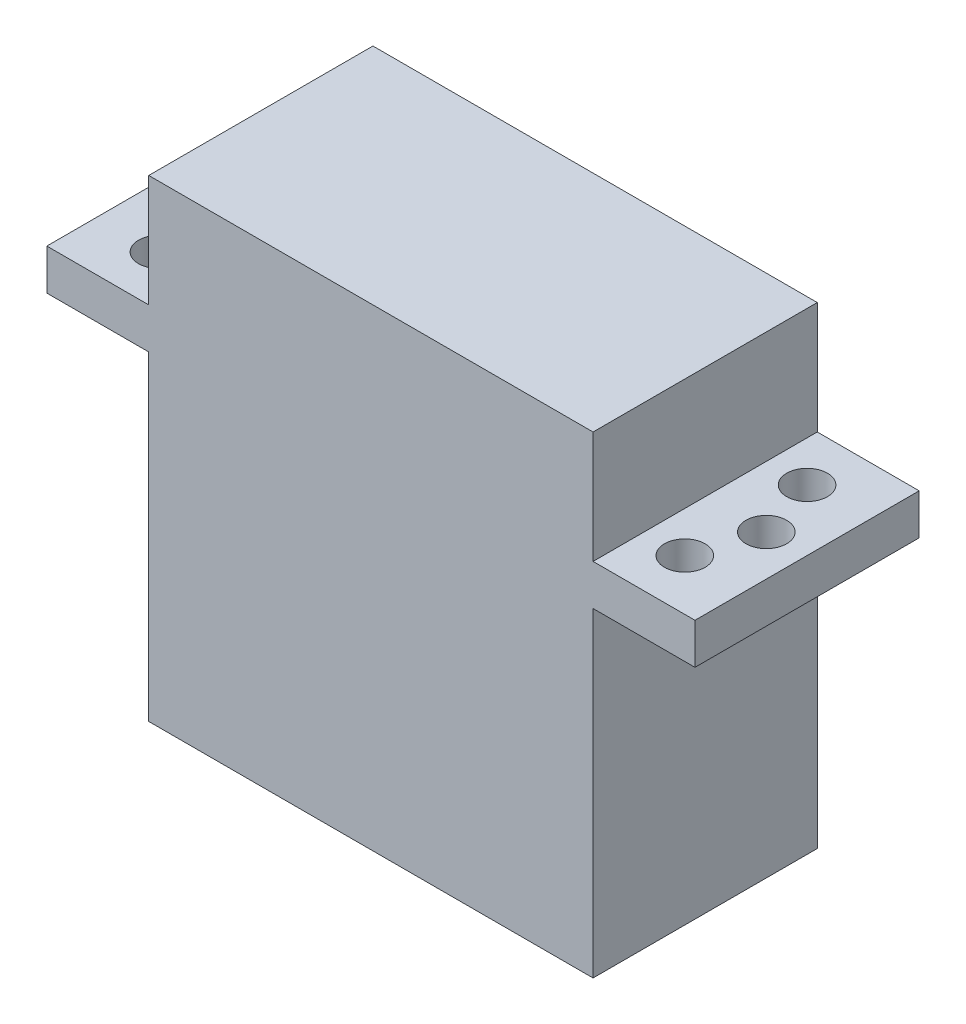
ISO-10303-21;
HEADER;
FILE_DESCRIPTION(('STEP AP214'),'2;1');
FILE_NAME('part.step','',(''),(''),'','','');
FILE_SCHEMA(('AUTOMOTIVE_DESIGN { 1 0 10303 214 1 1 1 1 }'));
ENDSEC;
DATA;
#1=APPLICATION_CONTEXT('core data for automotive mechanical design processes');
#2=APPLICATION_PROTOCOL_DEFINITION('international standard','automotive_design',2000,#1);
#3=PRODUCT_CONTEXT('',#1,'mechanical');
#4=PRODUCT('Part','Part','',(#3));
#5=PRODUCT_RELATED_PRODUCT_CATEGORY('part','',(#4));
#6=PRODUCT_DEFINITION_FORMATION('','',#4);
#7=PRODUCT_DEFINITION_CONTEXT('part definition',#1,'design');
#8=PRODUCT_DEFINITION('design','',#6,#7);
#9=PRODUCT_DEFINITION_SHAPE('','',#8);
#10=(LENGTH_UNIT() NAMED_UNIT(*) SI_UNIT(.MILLI.,.METRE.));
#11=(NAMED_UNIT(*) PLANE_ANGLE_UNIT() SI_UNIT($,.RADIAN.));
#12=(NAMED_UNIT(*) SI_UNIT($,.STERADIAN.) SOLID_ANGLE_UNIT());
#13=UNCERTAINTY_MEASURE_WITH_UNIT(LENGTH_MEASURE(1.E-05),#10,'distance_accuracy_value','');
#14=(GEOMETRIC_REPRESENTATION_CONTEXT(3) GLOBAL_UNCERTAINTY_ASSIGNED_CONTEXT((#13)) GLOBAL_UNIT_ASSIGNED_CONTEXT((#10,
#11,#12)) REPRESENTATION_CONTEXT('',''));
#15=CARTESIAN_POINT('',(0.,0.,0.));
#16=DIRECTION('',(0.,0.,1.));
#17=DIRECTION('',(1.,0.,0.));
#18=AXIS2_PLACEMENT_3D('',#15,#16,#17);
#19=CARTESIAN_POINT('',(-10.9,-11.6,5.5));
#20=DIRECTION('',(1.,0.,0.));
#21=DIRECTION('',(0.,0.,-1.));
#22=AXIS2_PLACEMENT_3D('',#19,#20,#21);
#23=PLANE('',#22);
#24=DIRECTION('',(0.,0.,1.));
#25=VECTOR('',#24,1.);
#26=CARTESIAN_POINT('',(-10.9,4.1,5.5));
#27=LINE('',#26,#25);
#28=CARTESIAN_POINT('',(-10.9,4.1,-5.5));
#29=VERTEX_POINT('',#28);
#30=CARTESIAN_POINT('',(-10.9,4.1,5.5));
#31=VERTEX_POINT('',#30);
#32=EDGE_CURVE('E141',#29,#31,#27,.T.);
#33=ORIENTED_EDGE('',*,*,#32,.F.);
#34=DIRECTION('',(0.,-1.,0.));
#35=VECTOR('',#34,1.);
#36=CARTESIAN_POINT('',(-10.9,-11.6,-5.5));
#37=LINE('',#36,#35);
#38=CARTESIAN_POINT('',(-10.9,-11.6,-5.5));
#39=VERTEX_POINT('',#38);
#40=EDGE_CURVE('E179',#29,#39,#37,.T.);
#41=ORIENTED_EDGE('',*,*,#40,.T.);
#42=DIRECTION('',(0.,0.,-1.));
#43=VECTOR('',#42,1.);
#44=CARTESIAN_POINT('',(-10.9,-11.6,5.5));
#45=LINE('',#44,#43);
#46=CARTESIAN_POINT('',(-10.9,-11.6,5.5));
#47=VERTEX_POINT('',#46);
#48=EDGE_CURVE('E11',#47,#39,#45,.T.);
#49=ORIENTED_EDGE('',*,*,#48,.F.);
#50=DIRECTION('',(0.,-1.,0.));
#51=VECTOR('',#50,1.);
#52=CARTESIAN_POINT('',(-10.9,-11.6,5.5));
#53=LINE('',#52,#51);
#54=EDGE_CURVE('E183',#31,#47,#53,.T.);
#55=ORIENTED_EDGE('',*,*,#54,.F.);
#56=EDGE_LOOP('',(#33,#41,#49,#55));
#57=FACE_BOUND('',#56,.T.);
#58=ADVANCED_FACE('F32',(#57),#23,.F.);
#59=CARTESIAN_POINT('',(10.9,-11.6,5.5));
#60=DIRECTION('',(-1.,0.,0.));
#61=DIRECTION('',(0.,0.,1.));
#62=AXIS2_PLACEMENT_3D('',#59,#60,#61);
#63=PLANE('',#62);
#64=DIRECTION('',(0.,0.,-1.));
#65=VECTOR('',#64,1.);
#66=CARTESIAN_POINT('',(10.9,4.1,5.5));
#67=LINE('',#66,#65);
#68=CARTESIAN_POINT('',(10.9,4.1,5.5));
#69=VERTEX_POINT('',#68);
#70=CARTESIAN_POINT('',(10.9,4.1,-5.5));
#71=VERTEX_POINT('',#70);
#72=EDGE_CURVE('E176',#69,#71,#67,.T.);
#73=ORIENTED_EDGE('',*,*,#72,.F.);
#74=DIRECTION('',(0.,1.,0.));
#75=VECTOR('',#74,1.);
#76=CARTESIAN_POINT('',(10.9,-11.6,5.5));
#77=LINE('',#76,#75);
#78=CARTESIAN_POINT('',(10.9,-11.6,5.5));
#79=VERTEX_POINT('',#78);
#80=EDGE_CURVE('E186',#79,#69,#77,.T.);
#81=ORIENTED_EDGE('',*,*,#80,.F.);
#82=DIRECTION('',(0.,0.,-1.));
#83=VECTOR('',#82,1.);
#84=CARTESIAN_POINT('',(10.9,-11.6,5.5));
#85=LINE('',#84,#83);
#86=CARTESIAN_POINT('',(10.9,-11.6,-5.5));
#87=VERTEX_POINT('',#86);
#88=EDGE_CURVE('E41',#79,#87,#85,.T.);
#89=ORIENTED_EDGE('',*,*,#88,.T.);
#90=DIRECTION('',(0.,1.,0.));
#91=VECTOR('',#90,1.);
#92=CARTESIAN_POINT('',(10.9,-11.6,-5.5));
#93=LINE('',#92,#91);
#94=EDGE_CURVE('E198',#87,#71,#93,.T.);
#95=ORIENTED_EDGE('',*,*,#94,.T.);
#96=EDGE_LOOP('',(#73,#81,#89,#95));
#97=FACE_BOUND('',#96,.T.);
#98=ADVANCED_FACE('F235',(#97),#63,.F.);
#99=CARTESIAN_POINT('',(-10.9,11.6,-5.5));
#100=VERTEX_POINT('',#99);
#101=CARTESIAN_POINT('',(-10.9,6.1,-5.5));
#102=VERTEX_POINT('',#101);
#103=EDGE_CURVE('E192',#100,#102,#37,.T.);
#104=ORIENTED_EDGE('',*,*,#103,.T.);
#105=DIRECTION('',(0.,0.,1.));
#106=VECTOR('',#105,1.);
#107=CARTESIAN_POINT('',(-10.9,6.1,5.5));
#108=LINE('',#107,#106);
#109=CARTESIAN_POINT('',(-10.9,6.1,5.5));
#110=VERTEX_POINT('',#109);
#111=EDGE_CURVE('E174',#102,#110,#108,.T.);
#112=ORIENTED_EDGE('',*,*,#111,.T.);
#113=CARTESIAN_POINT('',(-10.9,11.6,5.5));
#114=VERTEX_POINT('',#113);
#115=EDGE_CURVE('E180',#114,#110,#53,.T.);
#116=ORIENTED_EDGE('',*,*,#115,.F.);
#117=DIRECTION('',(0.,0.,-1.));
#118=VECTOR('',#117,1.);
#119=CARTESIAN_POINT('',(-10.9,11.6,5.5));
#120=LINE('',#119,#118);
#121=EDGE_CURVE('E191',#114,#100,#120,.T.);
#122=ORIENTED_EDGE('',*,*,#121,.T.);
#123=EDGE_LOOP('',(#104,#112,#116,#122));
#124=FACE_BOUND('',#123,.T.);
#125=ADVANCED_FACE('F34',(#124),#23,.F.);
#126=CARTESIAN_POINT('',(10.9,-11.6,5.5));
#127=DIRECTION('',(0.,1.,0.));
#128=DIRECTION('',(-1.,0.,0.));
#129=AXIS2_PLACEMENT_3D('',#126,#127,#128);
#130=PLANE('',#129);
#131=DIRECTION('',(1.,0.,0.));
#132=VECTOR('',#131,1.);
#133=CARTESIAN_POINT('',(10.9,-11.6,-5.5));
#134=LINE('',#133,#132);
#135=EDGE_CURVE('E195',#39,#87,#134,.T.);
#136=ORIENTED_EDGE('',*,*,#135,.T.);
#137=ORIENTED_EDGE('',*,*,#88,.F.);
#138=DIRECTION('',(1.,0.,0.));
#139=VECTOR('',#138,1.);
#140=CARTESIAN_POINT('',(10.9,-11.6,5.5));
#141=LINE('',#140,#139);
#142=EDGE_CURVE('E182',#47,#79,#141,.T.);
#143=ORIENTED_EDGE('',*,*,#142,.F.);
#144=ORIENTED_EDGE('',*,*,#48,.T.);
#145=EDGE_LOOP('',(#136,#137,#143,#144));
#146=FACE_BOUND('',#145,.T.);
#147=ADVANCED_FACE('F244',(#146),#130,.F.);
#148=CARTESIAN_POINT('',(10.9,6.1,5.5));
#149=VERTEX_POINT('',#148);
#150=CARTESIAN_POINT('',(10.9,11.6,5.5));
#151=VERTEX_POINT('',#150);
#152=EDGE_CURVE('E185',#149,#151,#77,.T.);
#153=ORIENTED_EDGE('',*,*,#152,.F.);
#154=DIRECTION('',(0.,0.,-1.));
#155=VECTOR('',#154,1.);
#156=CARTESIAN_POINT('',(10.9,6.1,5.5));
#157=LINE('',#156,#155);
#158=CARTESIAN_POINT('',(10.9,6.1,-5.5));
#159=VERTEX_POINT('',#158);
#160=EDGE_CURVE('E168',#149,#159,#157,.T.);
#161=ORIENTED_EDGE('',*,*,#160,.T.);
#162=CARTESIAN_POINT('',(10.9,11.6,-5.5));
#163=VERTEX_POINT('',#162);
#164=EDGE_CURVE('E197',#159,#163,#93,.T.);
#165=ORIENTED_EDGE('',*,*,#164,.T.);
#166=DIRECTION('',(0.,0.,-1.));
#167=VECTOR('',#166,1.);
#168=CARTESIAN_POINT('',(10.9,11.6,5.5));
#169=LINE('',#168,#167);
#170=EDGE_CURVE('E205',#151,#163,#169,.T.);
#171=ORIENTED_EDGE('',*,*,#170,.F.);
#172=EDGE_LOOP('',(#153,#161,#165,#171));
#173=FACE_BOUND('',#172,.T.);
#174=ADVANCED_FACE('F242',(#173),#63,.F.);
#175=CARTESIAN_POINT('',(10.9,11.6,5.5));
#176=DIRECTION('',(0.,-1.,0.));
#177=DIRECTION('',(1.,0.,0.));
#178=AXIS2_PLACEMENT_3D('',#175,#176,#177);
#179=PLANE('',#178);
#180=DIRECTION('',(-1.,0.,0.));
#181=VECTOR('',#180,1.);
#182=CARTESIAN_POINT('',(10.9,11.6,-5.5));
#183=LINE('',#182,#181);
#184=EDGE_CURVE('E201',#163,#100,#183,.T.);
#185=ORIENTED_EDGE('',*,*,#184,.T.);
#186=ORIENTED_EDGE('',*,*,#121,.F.);
#187=DIRECTION('',(-1.,0.,0.));
#188=VECTOR('',#187,1.);
#189=CARTESIAN_POINT('',(10.9,11.6,5.5));
#190=LINE('',#189,#188);
#191=EDGE_CURVE('E189',#151,#114,#190,.T.);
#192=ORIENTED_EDGE('',*,*,#191,.F.);
#193=ORIENTED_EDGE('',*,*,#170,.T.);
#194=EDGE_LOOP('',(#185,#186,#192,#193));
#195=FACE_BOUND('',#194,.T.);
#196=ADVANCED_FACE('F300',(#195),#179,.F.);
#197=CARTESIAN_POINT('',(0.,0.,5.5));
#198=DIRECTION('',(0.,0.,1.));
#199=DIRECTION('',(1.,0.,0.));
#200=AXIS2_PLACEMENT_3D('',#197,#198,#199);
#201=PLANE('',#200);
#202=ORIENTED_EDGE('',*,*,#115,.T.);
#203=DIRECTION('',(1.,0.,0.));
#204=VECTOR('',#203,1.);
#205=CARTESIAN_POINT('',(15.9,6.1,5.5));
#206=LINE('',#205,#204);
#207=CARTESIAN_POINT('',(-15.9,6.1,5.5));
#208=VERTEX_POINT('',#207);
#209=EDGE_CURVE('E49',#208,#110,#206,.T.);
#210=ORIENTED_EDGE('',*,*,#209,.F.);
#211=DIRECTION('',(0.,1.,0.));
#212=VECTOR('',#211,1.);
#213=CARTESIAN_POINT('',(-15.9,4.1,5.5));
#214=LINE('',#213,#212);
#215=CARTESIAN_POINT('',(-15.9,4.1,5.5));
#216=VERTEX_POINT('',#215);
#217=EDGE_CURVE('E124',#216,#208,#214,.T.);
#218=ORIENTED_EDGE('',*,*,#217,.F.);
#219=DIRECTION('',(1.,0.,0.));
#220=VECTOR('',#219,1.);
#221=CARTESIAN_POINT('',(15.9,4.1,5.5));
#222=LINE('',#221,#220);
#223=EDGE_CURVE('E128',#216,#31,#222,.T.);
#224=ORIENTED_EDGE('',*,*,#223,.T.);
#225=ORIENTED_EDGE('',*,*,#54,.T.);
#226=ORIENTED_EDGE('',*,*,#142,.T.);
#227=ORIENTED_EDGE('',*,*,#80,.T.);
#228=CARTESIAN_POINT('',(15.9,4.1,5.5));
#229=VERTEX_POINT('',#228);
#230=EDGE_CURVE('E143',#69,#229,#222,.T.);
#231=ORIENTED_EDGE('',*,*,#230,.T.);
#232=DIRECTION('',(0.,1.,0.));
#233=VECTOR('',#232,1.);
#234=CARTESIAN_POINT('',(15.9,4.1,5.5));
#235=LINE('',#234,#233);
#236=CARTESIAN_POINT('',(15.9,6.1,5.5));
#237=VERTEX_POINT('',#236);
#238=EDGE_CURVE('E133',#229,#237,#235,.T.);
#239=ORIENTED_EDGE('',*,*,#238,.T.);
#240=EDGE_CURVE('E163',#149,#237,#206,.T.);
#241=ORIENTED_EDGE('',*,*,#240,.F.);
#242=ORIENTED_EDGE('',*,*,#152,.T.);
#243=ORIENTED_EDGE('',*,*,#191,.T.);
#244=EDGE_LOOP('',(#202,#210,#218,#224,#225,#226,#227,#231,#239,#241,#242,#243));
#245=FACE_BOUND('',#244,.T.);
#246=ADVANCED_FACE('F127',(#245),#201,.T.);
#247=CARTESIAN_POINT('',(0.,0.,-5.5));
#248=DIRECTION('',(0.,0.,1.));
#249=DIRECTION('',(1.,0.,0.));
#250=AXIS2_PLACEMENT_3D('',#247,#248,#249);
#251=PLANE('',#250);
#252=ORIENTED_EDGE('',*,*,#164,.F.);
#253=DIRECTION('',(-1.,0.,0.));
#254=VECTOR('',#253,1.);
#255=CARTESIAN_POINT('',(15.9,6.1,-5.5));
#256=LINE('',#255,#254);
#257=CARTESIAN_POINT('',(15.9,6.1,-5.5));
#258=VERTEX_POINT('',#257);
#259=EDGE_CURVE('E57',#258,#159,#256,.T.);
#260=ORIENTED_EDGE('',*,*,#259,.F.);
#261=DIRECTION('',(0.,1.,0.));
#262=VECTOR('',#261,1.);
#263=CARTESIAN_POINT('',(15.9,4.1,-5.5));
#264=LINE('',#263,#262);
#265=CARTESIAN_POINT('',(15.9,4.1,-5.5));
#266=VERTEX_POINT('',#265);
#267=EDGE_CURVE('E169',#266,#258,#264,.T.);
#268=ORIENTED_EDGE('',*,*,#267,.F.);
#269=DIRECTION('',(-1.,0.,0.));
#270=VECTOR('',#269,1.);
#271=CARTESIAN_POINT('',(15.9,4.1,-5.5));
#272=LINE('',#271,#270);
#273=EDGE_CURVE('E134',#266,#71,#272,.T.);
#274=ORIENTED_EDGE('',*,*,#273,.T.);
#275=ORIENTED_EDGE('',*,*,#94,.F.);
#276=ORIENTED_EDGE('',*,*,#135,.F.);
#277=ORIENTED_EDGE('',*,*,#40,.F.);
#278=CARTESIAN_POINT('',(-15.9,4.1,-5.5));
#279=VERTEX_POINT('',#278);
#280=EDGE_CURVE('E158',#29,#279,#272,.T.);
#281=ORIENTED_EDGE('',*,*,#280,.T.);
#282=DIRECTION('',(0.,1.,0.));
#283=VECTOR('',#282,1.);
#284=CARTESIAN_POINT('',(-15.9,4.1,-5.5));
#285=LINE('',#284,#283);
#286=CARTESIAN_POINT('',(-15.9,6.1,-5.5));
#287=VERTEX_POINT('',#286);
#288=EDGE_CURVE('E148',#279,#287,#285,.T.);
#289=ORIENTED_EDGE('',*,*,#288,.T.);
#290=EDGE_CURVE('E150',#102,#287,#256,.T.);
#291=ORIENTED_EDGE('',*,*,#290,.F.);
#292=ORIENTED_EDGE('',*,*,#103,.F.);
#293=ORIENTED_EDGE('',*,*,#184,.F.);
#294=EDGE_LOOP('',(#252,#260,#268,#274,#275,#276,#277,#281,#289,#291,#292,#293));
#295=FACE_BOUND('',#294,.T.);
#296=ADVANCED_FACE('F257',(#295),#251,.F.);
#297=CARTESIAN_POINT('',(15.9,4.1,5.5));
#298=DIRECTION('',(1.,0.,0.));
#299=DIRECTION('',(0.,1.,0.));
#300=AXIS2_PLACEMENT_3D('',#297,#298,#299);
#301=PLANE('',#300);
#302=DIRECTION('',(0.,0.,-1.));
#303=VECTOR('',#302,1.);
#304=CARTESIAN_POINT('',(15.9,6.1,5.5));
#305=LINE('',#304,#303);
#306=EDGE_CURVE('E165',#237,#258,#305,.T.);
#307=ORIENTED_EDGE('',*,*,#306,.F.);
#308=ORIENTED_EDGE('',*,*,#238,.F.);
#309=DIRECTION('',(0.,0.,-1.));
#310=VECTOR('',#309,1.);
#311=CARTESIAN_POINT('',(15.9,4.1,5.5));
#312=LINE('',#311,#310);
#313=EDGE_CURVE('E142',#229,#266,#312,.T.);
#314=ORIENTED_EDGE('',*,*,#313,.T.);
#315=ORIENTED_EDGE('',*,*,#267,.T.);
#316=EDGE_LOOP('',(#307,#308,#314,#315));
#317=FACE_BOUND('',#316,.T.);
#318=ADVANCED_FACE('F275',(#317),#301,.T.);
#319=CARTESIAN_POINT('',(0.,6.1,0.));
#320=DIRECTION('',(0.,1.,0.));
#321=DIRECTION('',(-1.,0.,0.));
#322=AXIS2_PLACEMENT_3D('',#319,#320,#321);
#323=PLANE('',#322);
#324=CARTESIAN_POINT('',(12.9,6.1,3.));
#325=DIRECTION('',(0.,1.,0.));
#326=DIRECTION('',(1.,0.,0.));
#327=AXIS2_PLACEMENT_3D('',#324,#325,#326);
#328=CIRCLE('',#327,1.);
#329=CARTESIAN_POINT('',(13.9,6.1,3.));
#330=VERTEX_POINT('',#329);
#331=EDGE_CURVE('E284',#330,#330,#328,.T.);
#332=ORIENTED_EDGE('',*,*,#331,.F.);
#333=EDGE_LOOP('',(#332));
#334=FACE_BOUND('',#333,.T.);
#335=CARTESIAN_POINT('',(12.9,6.1,-3.));
#336=DIRECTION('',(0.,1.,0.));
#337=DIRECTION('',(1.,0.,0.));
#338=AXIS2_PLACEMENT_3D('',#335,#336,#337);
#339=CIRCLE('',#338,1.);
#340=CARTESIAN_POINT('',(13.9,6.1,-3.));
#341=VERTEX_POINT('',#340);
#342=EDGE_CURVE('E288',#341,#341,#339,.T.);
#343=ORIENTED_EDGE('',*,*,#342,.F.);
#344=EDGE_LOOP('',(#343));
#345=FACE_BOUND('',#344,.T.);
#346=CARTESIAN_POINT('',(13.9,6.1,0.));
#347=DIRECTION('',(0.,1.,0.));
#348=DIRECTION('',(1.,0.,0.));
#349=AXIS2_PLACEMENT_3D('',#346,#347,#348);
#350=CIRCLE('',#349,1.);
#351=CARTESIAN_POINT('',(14.9,6.1,0.));
#352=VERTEX_POINT('',#351);
#353=EDGE_CURVE('E291',#352,#352,#350,.T.);
#354=ORIENTED_EDGE('',*,*,#353,.F.);
#355=EDGE_LOOP('',(#354));
#356=FACE_BOUND('',#355,.T.);
#357=ORIENTED_EDGE('',*,*,#160,.F.);
#358=ORIENTED_EDGE('',*,*,#240,.T.);
#359=ORIENTED_EDGE('',*,*,#306,.T.);
#360=ORIENTED_EDGE('',*,*,#259,.T.);
#361=EDGE_LOOP('',(#357,#358,#359,#360));
#362=FACE_BOUND('',#361,.T.);
#363=ADVANCED_FACE('F262',(#334,#345,#356,#362),#323,.T.);
#364=CARTESIAN_POINT('',(0.,4.1,0.));
#365=DIRECTION('',(0.,1.,0.));
#366=DIRECTION('',(-1.,0.,0.));
#367=AXIS2_PLACEMENT_3D('',#364,#365,#366);
#368=PLANE('',#367);
#369=CARTESIAN_POINT('',(12.9,4.1,3.));
#370=DIRECTION('',(0.,1.,0.));
#371=DIRECTION('',(-1.,0.,0.));
#372=AXIS2_PLACEMENT_3D('',#369,#370,#371);
#373=CIRCLE('',#372,1.);
#374=CARTESIAN_POINT('',(11.9,4.1,3.));
#375=VERTEX_POINT('',#374);
#376=EDGE_CURVE('E36',#375,#375,#373,.T.);
#377=ORIENTED_EDGE('',*,*,#376,.T.);
#378=EDGE_LOOP('',(#377));
#379=FACE_BOUND('',#378,.T.);
#380=CARTESIAN_POINT('',(12.9,4.1,-3.));
#381=DIRECTION('',(0.,1.,0.));
#382=DIRECTION('',(-1.,0.,0.));
#383=AXIS2_PLACEMENT_3D('',#380,#381,#382);
#384=CIRCLE('',#383,1.);
#385=CARTESIAN_POINT('',(11.9,4.1,-3.));
#386=VERTEX_POINT('',#385);
#387=EDGE_CURVE('E212',#386,#386,#384,.T.);
#388=ORIENTED_EDGE('',*,*,#387,.T.);
#389=EDGE_LOOP('',(#388));
#390=FACE_BOUND('',#389,.T.);
#391=CARTESIAN_POINT('',(13.9,4.1,0.));
#392=DIRECTION('',(0.,1.,0.));
#393=DIRECTION('',(-1.,0.,0.));
#394=AXIS2_PLACEMENT_3D('',#391,#392,#393);
#395=CIRCLE('',#394,1.);
#396=CARTESIAN_POINT('',(12.9,4.1,0.));
#397=VERTEX_POINT('',#396);
#398=EDGE_CURVE('E210',#397,#397,#395,.T.);
#399=ORIENTED_EDGE('',*,*,#398,.T.);
#400=EDGE_LOOP('',(#399));
#401=FACE_BOUND('',#400,.T.);
#402=ORIENTED_EDGE('',*,*,#230,.F.);
#403=ORIENTED_EDGE('',*,*,#72,.T.);
#404=ORIENTED_EDGE('',*,*,#273,.F.);
#405=ORIENTED_EDGE('',*,*,#313,.F.);
#406=EDGE_LOOP('',(#402,#403,#404,#405));
#407=FACE_BOUND('',#406,.T.);
#408=ADVANCED_FACE('F219',(#379,#390,#401,#407),#368,.F.);
#409=CARTESIAN_POINT('',(-12.9,4.1,-3.));
#410=DIRECTION('',(0.,1.,0.));
#411=DIRECTION('',(-1.,0.,0.));
#412=AXIS2_PLACEMENT_3D('',#409,#410,#411);
#413=CIRCLE('',#412,1.);
#414=CARTESIAN_POINT('',(-13.9,4.1,-3.));
#415=VERTEX_POINT('',#414);
#416=EDGE_CURVE('E153',#415,#415,#413,.T.);
#417=ORIENTED_EDGE('',*,*,#416,.T.);
#418=EDGE_LOOP('',(#417));
#419=FACE_BOUND('',#418,.T.);
#420=CARTESIAN_POINT('',(-12.9,4.1,3.));
#421=DIRECTION('',(0.,1.,0.));
#422=DIRECTION('',(-1.,0.,0.));
#423=AXIS2_PLACEMENT_3D('',#420,#421,#422);
#424=CIRCLE('',#423,1.);
#425=CARTESIAN_POINT('',(-13.9,4.1,3.));
#426=VERTEX_POINT('',#425);
#427=EDGE_CURVE('E424',#426,#426,#424,.T.);
#428=ORIENTED_EDGE('',*,*,#427,.T.);
#429=EDGE_LOOP('',(#428));
#430=FACE_BOUND('',#429,.T.);
#431=CARTESIAN_POINT('',(-13.9,4.1,0.));
#432=DIRECTION('',(0.,1.,0.));
#433=DIRECTION('',(-1.,0.,0.));
#434=AXIS2_PLACEMENT_3D('',#431,#432,#433);
#435=CIRCLE('',#434,1.);
#436=CARTESIAN_POINT('',(-14.9,4.1,0.));
#437=VERTEX_POINT('',#436);
#438=EDGE_CURVE('E422',#437,#437,#435,.T.);
#439=ORIENTED_EDGE('',*,*,#438,.T.);
#440=EDGE_LOOP('',(#439));
#441=FACE_BOUND('',#440,.T.);
#442=ORIENTED_EDGE('',*,*,#280,.F.);
#443=ORIENTED_EDGE('',*,*,#32,.T.);
#444=ORIENTED_EDGE('',*,*,#223,.F.);
#445=DIRECTION('',(0.,0.,1.));
#446=VECTOR('',#445,1.);
#447=CARTESIAN_POINT('',(-15.9,4.1,5.5));
#448=LINE('',#447,#446);
#449=EDGE_CURVE('E139',#279,#216,#448,.T.);
#450=ORIENTED_EDGE('',*,*,#449,.F.);
#451=EDGE_LOOP('',(#442,#443,#444,#450));
#452=FACE_BOUND('',#451,.T.);
#453=ADVANCED_FACE('F138',(#419,#430,#441,#452),#368,.F.);
#454=CARTESIAN_POINT('',(-12.9,6.1,-3.));
#455=DIRECTION('',(0.,1.,0.));
#456=DIRECTION('',(-1.,0.,0.));
#457=AXIS2_PLACEMENT_3D('',#454,#455,#456);
#458=CIRCLE('',#457,1.);
#459=CARTESIAN_POINT('',(-13.9,6.1,-3.));
#460=VERTEX_POINT('',#459);
#461=EDGE_CURVE('E412',#460,#460,#458,.T.);
#462=ORIENTED_EDGE('',*,*,#461,.F.);
#463=EDGE_LOOP('',(#462));
#464=FACE_BOUND('',#463,.T.);
#465=CARTESIAN_POINT('',(-12.9,6.1,3.));
#466=DIRECTION('',(0.,1.,0.));
#467=DIRECTION('',(-1.,0.,0.));
#468=AXIS2_PLACEMENT_3D('',#465,#466,#467);
#469=CIRCLE('',#468,1.);
#470=CARTESIAN_POINT('',(-13.9,6.1,3.));
#471=VERTEX_POINT('',#470);
#472=EDGE_CURVE('E416',#471,#471,#469,.T.);
#473=ORIENTED_EDGE('',*,*,#472,.F.);
#474=EDGE_LOOP('',(#473));
#475=FACE_BOUND('',#474,.T.);
#476=CARTESIAN_POINT('',(-13.9,6.1,0.));
#477=DIRECTION('',(0.,1.,0.));
#478=DIRECTION('',(-1.,0.,0.));
#479=AXIS2_PLACEMENT_3D('',#476,#477,#478);
#480=CIRCLE('',#479,1.);
#481=CARTESIAN_POINT('',(-14.9,6.1,0.));
#482=VERTEX_POINT('',#481);
#483=EDGE_CURVE('E415',#482,#482,#480,.T.);
#484=ORIENTED_EDGE('',*,*,#483,.F.);
#485=EDGE_LOOP('',(#484));
#486=FACE_BOUND('',#485,.T.);
#487=ORIENTED_EDGE('',*,*,#111,.F.);
#488=ORIENTED_EDGE('',*,*,#290,.T.);
#489=DIRECTION('',(0.,0.,1.));
#490=VECTOR('',#489,1.);
#491=CARTESIAN_POINT('',(-15.9,6.1,5.5));
#492=LINE('',#491,#490);
#493=EDGE_CURVE('E161',#287,#208,#492,.T.);
#494=ORIENTED_EDGE('',*,*,#493,.T.);
#495=ORIENTED_EDGE('',*,*,#209,.T.);
#496=EDGE_LOOP('',(#487,#488,#494,#495));
#497=FACE_BOUND('',#496,.T.);
#498=ADVANCED_FACE('F258',(#464,#475,#486,#497),#323,.T.);
#499=CARTESIAN_POINT('',(-15.9,4.1,5.5));
#500=DIRECTION('',(-1.,0.,0.));
#501=DIRECTION('',(0.,-1.,0.));
#502=AXIS2_PLACEMENT_3D('',#499,#500,#501);
#503=PLANE('',#502);
#504=ORIENTED_EDGE('',*,*,#493,.F.);
#505=ORIENTED_EDGE('',*,*,#288,.F.);
#506=ORIENTED_EDGE('',*,*,#449,.T.);
#507=ORIENTED_EDGE('',*,*,#217,.T.);
#508=EDGE_LOOP('',(#504,#505,#506,#507));
#509=FACE_BOUND('',#508,.T.);
#510=ADVANCED_FACE('F146',(#509),#503,.T.);
#511=CARTESIAN_POINT('',(-13.9,-11.6,0.));
#512=DIRECTION('',(0.,1.,0.));
#513=DIRECTION('',(-1.,0.,0.));
#514=AXIS2_PLACEMENT_3D('',#511,#512,#513);
#515=CYLINDRICAL_SURFACE('',#514,1.);
#516=ORIENTED_EDGE('',*,*,#483,.T.);
#517=EDGE_LOOP('',(#516));
#518=FACE_BOUND('',#517,.T.);
#519=ORIENTED_EDGE('',*,*,#438,.F.);
#520=EDGE_LOOP('',(#519));
#521=FACE_BOUND('',#520,.T.);
#522=ADVANCED_FACE('F267',(#518,#521),#515,.F.);
#523=CARTESIAN_POINT('',(-12.9,-11.6,3.));
#524=DIRECTION('',(0.,1.,0.));
#525=DIRECTION('',(-1.,0.,0.));
#526=AXIS2_PLACEMENT_3D('',#523,#524,#525);
#527=CYLINDRICAL_SURFACE('',#526,1.);
#528=ORIENTED_EDGE('',*,*,#472,.T.);
#529=EDGE_LOOP('',(#528));
#530=FACE_BOUND('',#529,.T.);
#531=ORIENTED_EDGE('',*,*,#427,.F.);
#532=EDGE_LOOP('',(#531));
#533=FACE_BOUND('',#532,.T.);
#534=ADVANCED_FACE('F353',(#530,#533),#527,.F.);
#535=CARTESIAN_POINT('',(-12.9,-11.6,-3.));
#536=DIRECTION('',(0.,1.,0.));
#537=DIRECTION('',(-1.,0.,0.));
#538=AXIS2_PLACEMENT_3D('',#535,#536,#537);
#539=CYLINDRICAL_SURFACE('',#538,1.);
#540=ORIENTED_EDGE('',*,*,#461,.T.);
#541=EDGE_LOOP('',(#540));
#542=FACE_BOUND('',#541,.T.);
#543=ORIENTED_EDGE('',*,*,#416,.F.);
#544=EDGE_LOOP('',(#543));
#545=FACE_BOUND('',#544,.T.);
#546=ADVANCED_FACE('F363',(#542,#545),#539,.F.);
#547=CARTESIAN_POINT('',(13.9,-11.6,0.));
#548=DIRECTION('',(0.,1.,0.));
#549=DIRECTION('',(-1.,0.,0.));
#550=AXIS2_PLACEMENT_3D('',#547,#548,#549);
#551=CYLINDRICAL_SURFACE('',#550,1.);
#552=ORIENTED_EDGE('',*,*,#353,.T.);
#553=EDGE_LOOP('',(#552));
#554=FACE_BOUND('',#553,.T.);
#555=ORIENTED_EDGE('',*,*,#398,.F.);
#556=EDGE_LOOP('',(#555));
#557=FACE_BOUND('',#556,.T.);
#558=ADVANCED_FACE('F229',(#554,#557),#551,.F.);
#559=CARTESIAN_POINT('',(12.9,-11.6,-3.));
#560=DIRECTION('',(0.,1.,0.));
#561=DIRECTION('',(-1.,0.,0.));
#562=AXIS2_PLACEMENT_3D('',#559,#560,#561);
#563=CYLINDRICAL_SURFACE('',#562,1.);
#564=ORIENTED_EDGE('',*,*,#342,.T.);
#565=EDGE_LOOP('',(#564));
#566=FACE_BOUND('',#565,.T.);
#567=ORIENTED_EDGE('',*,*,#387,.F.);
#568=EDGE_LOOP('',(#567));
#569=FACE_BOUND('',#568,.T.);
#570=ADVANCED_FACE('F223',(#566,#569),#563,.F.);
#571=CARTESIAN_POINT('',(12.9,-11.6,3.));
#572=DIRECTION('',(0.,1.,0.));
#573=DIRECTION('',(-1.,0.,0.));
#574=AXIS2_PLACEMENT_3D('',#571,#572,#573);
#575=CYLINDRICAL_SURFACE('',#574,1.);
#576=ORIENTED_EDGE('',*,*,#331,.T.);
#577=EDGE_LOOP('',(#576));
#578=FACE_BOUND('',#577,.T.);
#579=ORIENTED_EDGE('',*,*,#376,.F.);
#580=EDGE_LOOP('',(#579));
#581=FACE_BOUND('',#580,.T.);
#582=ADVANCED_FACE('F221',(#578,#581),#575,.F.);
#583=CLOSED_SHELL('',(#58,#98,#125,#147,#174,#196,#246,#296,#318,#363,#408,#453,#498,#510,#522,
#534,#546,#558,#570,#582));
#584=MANIFOLD_SOLID_BREP('B2',#583);
#585=ADVANCED_BREP_SHAPE_REPRESENTATION('',(#18,#584),#14);
#586=SHAPE_DEFINITION_REPRESENTATION(#9,#585);
ENDSEC;
END-ISO-10303-21;
